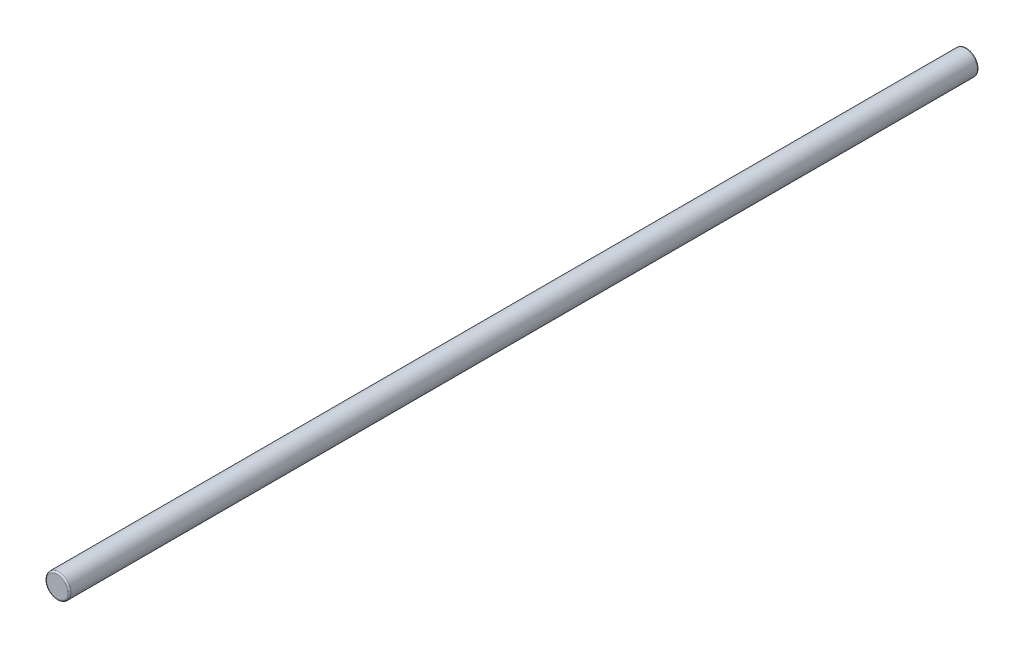
ISO-10303-21;
HEADER;
FILE_DESCRIPTION(('STEP AP214'),'2;1');
FILE_NAME('part.step','',(''),(''),'','','');
FILE_SCHEMA(('AUTOMOTIVE_DESIGN { 1 0 10303 214 1 1 1 1 }'));
ENDSEC;
DATA;
#1=APPLICATION_CONTEXT('core data for automotive mechanical design processes');
#2=APPLICATION_PROTOCOL_DEFINITION('international standard','automotive_design',2000,#1);
#3=PRODUCT_CONTEXT('',#1,'mechanical');
#4=PRODUCT('Part','Part','',(#3));
#5=PRODUCT_RELATED_PRODUCT_CATEGORY('part','',(#4));
#6=PRODUCT_DEFINITION_FORMATION('','',#4);
#7=PRODUCT_DEFINITION_CONTEXT('part definition',#1,'design');
#8=PRODUCT_DEFINITION('design','',#6,#7);
#9=PRODUCT_DEFINITION_SHAPE('','',#8);
#10=(LENGTH_UNIT() NAMED_UNIT(*) SI_UNIT(.MILLI.,.METRE.));
#11=(NAMED_UNIT(*) PLANE_ANGLE_UNIT() SI_UNIT($,.RADIAN.));
#12=(NAMED_UNIT(*) SI_UNIT($,.STERADIAN.) SOLID_ANGLE_UNIT());
#13=UNCERTAINTY_MEASURE_WITH_UNIT(LENGTH_MEASURE(1.E-05),#10,'distance_accuracy_value','');
#14=(GEOMETRIC_REPRESENTATION_CONTEXT(3) GLOBAL_UNCERTAINTY_ASSIGNED_CONTEXT((#13)) GLOBAL_UNIT_ASSIGNED_CONTEXT((#10,
#11,#12)) REPRESENTATION_CONTEXT('',''));
#15=CARTESIAN_POINT('',(0.,0.,0.));
#16=DIRECTION('',(0.,0.,1.));
#17=DIRECTION('',(1.,0.,0.));
#18=AXIS2_PLACEMENT_3D('',#15,#16,#17);
#19=CARTESIAN_POINT('',(0.,0.,300.));
#20=DIRECTION('',(0.,0.,-1.));
#21=DIRECTION('',(-1.,0.,0.));
#22=AXIS2_PLACEMENT_3D('',#19,#20,#21);
#23=CYLINDRICAL_SURFACE('',#22,4.);
#24=CARTESIAN_POINT('',(0.,0.,0.5));
#25=DIRECTION('',(0.,0.,1.));
#26=DIRECTION('',(1.,0.,0.));
#27=AXIS2_PLACEMENT_3D('',#24,#25,#26);
#28=CIRCLE('',#27,4.);
#29=CARTESIAN_POINT('',(4.,0.,0.5));
#30=VERTEX_POINT('',#29);
#31=EDGE_CURVE('E50',#30,#30,#28,.T.);
#32=ORIENTED_EDGE('',*,*,#31,.T.);
#33=EDGE_LOOP('',(#32));
#34=FACE_BOUND('',#33,.T.);
#35=CARTESIAN_POINT('',(0.,0.,299.5));
#36=DIRECTION('',(0.,0.,1.));
#37=DIRECTION('',(1.,0.,0.));
#38=AXIS2_PLACEMENT_3D('',#35,#36,#37);
#39=CIRCLE('',#38,4.);
#40=CARTESIAN_POINT('',(4.,0.,299.5));
#41=VERTEX_POINT('',#40);
#42=EDGE_CURVE('E55',#41,#41,#39,.F.);
#43=ORIENTED_EDGE('',*,*,#42,.T.);
#44=EDGE_LOOP('',(#43));
#45=FACE_BOUND('',#44,.T.);
#46=ADVANCED_FACE('F37',(#34,#45),#23,.T.);
#47=CARTESIAN_POINT('',(0.,0.,300.));
#48=DIRECTION('',(0.,0.,1.));
#49=DIRECTION('',(1.,0.,0.));
#50=AXIS2_PLACEMENT_3D('',#47,#48,#49);
#51=PLANE('',#50);
#52=CARTESIAN_POINT('',(0.,0.,300.));
#53=DIRECTION('',(0.,0.,1.));
#54=DIRECTION('',(1.,0.,0.));
#55=AXIS2_PLACEMENT_3D('',#52,#53,#54);
#56=CIRCLE('',#55,3.5);
#57=CARTESIAN_POINT('',(3.5,0.,300.));
#58=VERTEX_POINT('',#57);
#59=EDGE_CURVE('E10',#58,#58,#56,.T.);
#60=ORIENTED_EDGE('',*,*,#59,.T.);
#61=EDGE_LOOP('',(#60));
#62=FACE_BOUND('',#61,.T.);
#63=ADVANCED_FACE('F72',(#62),#51,.T.);
#64=CARTESIAN_POINT('',(0.,0.,0.));
#65=DIRECTION('',(0.,0.,1.));
#66=DIRECTION('',(1.,0.,0.));
#67=AXIS2_PLACEMENT_3D('',#64,#65,#66);
#68=PLANE('',#67);
#69=CARTESIAN_POINT('',(0.,0.,0.));
#70=DIRECTION('',(0.,0.,1.));
#71=DIRECTION('',(1.,0.,0.));
#72=AXIS2_PLACEMENT_3D('',#69,#70,#71);
#73=CIRCLE('',#72,3.5);
#74=CARTESIAN_POINT('',(3.5,0.,0.));
#75=VERTEX_POINT('',#74);
#76=EDGE_CURVE('E45',#75,#75,#73,.F.);
#77=ORIENTED_EDGE('',*,*,#76,.T.);
#78=EDGE_LOOP('',(#77));
#79=FACE_BOUND('',#78,.T.);
#80=ADVANCED_FACE('F69',(#79),#68,.F.);
#81=CARTESIAN_POINT('',(0.,0.,0.5));
#82=DIRECTION('',(0.,0.,1.));
#83=DIRECTION('',(1.,0.,0.));
#84=AXIS2_PLACEMENT_3D('',#81,#82,#83);
#85=TOROIDAL_SURFACE('',#84,3.5,0.5);
#86=ORIENTED_EDGE('',*,*,#76,.F.);
#87=EDGE_LOOP('',(#86));
#88=FACE_BOUND('',#87,.T.);
#89=ORIENTED_EDGE('',*,*,#31,.F.);
#90=EDGE_LOOP('',(#89));
#91=FACE_BOUND('',#90,.T.);
#92=ADVANCED_FACE('F65',(#88,#91),#85,.T.);
#93=CARTESIAN_POINT('',(0.,0.,299.5));
#94=DIRECTION('',(0.,0.,1.));
#95=DIRECTION('',(1.,0.,0.));
#96=AXIS2_PLACEMENT_3D('',#93,#94,#95);
#97=TOROIDAL_SURFACE('',#96,3.5,0.5);
#98=ORIENTED_EDGE('',*,*,#42,.F.);
#99=EDGE_LOOP('',(#98));
#100=FACE_BOUND('',#99,.T.);
#101=ORIENTED_EDGE('',*,*,#59,.F.);
#102=EDGE_LOOP('',(#101));
#103=FACE_BOUND('',#102,.T.);
#104=ADVANCED_FACE('F39',(#100,#103),#97,.T.);
#105=CLOSED_SHELL('',(#46,#63,#80,#92,#104));
#106=MANIFOLD_SOLID_BREP('B2',#105);
#107=ADVANCED_BREP_SHAPE_REPRESENTATION('',(#18,#106),#14);
#108=SHAPE_DEFINITION_REPRESENTATION(#9,#107);
ENDSEC;
END-ISO-10303-21;
